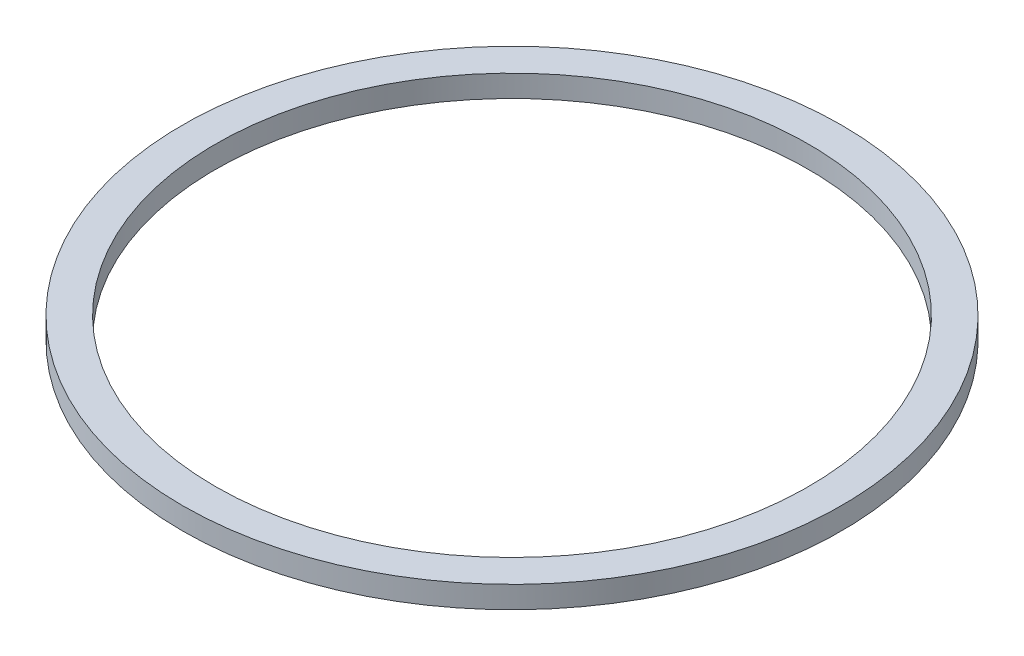
ISO-10303-21;
HEADER;
FILE_DESCRIPTION(('STEP AP214'),'2;1');
FILE_NAME('part.step','',(''),(''),'','','');
FILE_SCHEMA(('AUTOMOTIVE_DESIGN { 1 0 10303 214 1 1 1 1 }'));
ENDSEC;
DATA;
#1=APPLICATION_CONTEXT('core data for automotive mechanical design processes');
#2=APPLICATION_PROTOCOL_DEFINITION('international standard','automotive_design',2000,#1);
#3=PRODUCT_CONTEXT('',#1,'mechanical');
#4=PRODUCT('Part','Part','',(#3));
#5=PRODUCT_RELATED_PRODUCT_CATEGORY('part','',(#4));
#6=PRODUCT_DEFINITION_FORMATION('','',#4);
#7=PRODUCT_DEFINITION_CONTEXT('part definition',#1,'design');
#8=PRODUCT_DEFINITION('design','',#6,#7);
#9=PRODUCT_DEFINITION_SHAPE('','',#8);
#10=(LENGTH_UNIT() NAMED_UNIT(*) SI_UNIT(.MILLI.,.METRE.));
#11=(NAMED_UNIT(*) PLANE_ANGLE_UNIT() SI_UNIT($,.RADIAN.));
#12=(NAMED_UNIT(*) SI_UNIT($,.STERADIAN.) SOLID_ANGLE_UNIT());
#13=UNCERTAINTY_MEASURE_WITH_UNIT(LENGTH_MEASURE(1.E-05),#10,'distance_accuracy_value','');
#14=(GEOMETRIC_REPRESENTATION_CONTEXT(3) GLOBAL_UNCERTAINTY_ASSIGNED_CONTEXT((#13)) GLOBAL_UNIT_ASSIGNED_CONTEXT((#10,
#11,#12)) REPRESENTATION_CONTEXT('',''));
#15=CARTESIAN_POINT('',(0.,0.,0.));
#16=DIRECTION('',(0.,0.,1.));
#17=DIRECTION('',(1.,0.,0.));
#18=AXIS2_PLACEMENT_3D('',#15,#16,#17);
#19=CARTESIAN_POINT('',(0.,1.,0.));
#20=DIRECTION('',(0.,1.,0.));
#21=DIRECTION('',(0.,0.,1.));
#22=AXIS2_PLACEMENT_3D('',#19,#20,#21);
#23=PLANE('',#22);
#24=CARTESIAN_POINT('',(0.,1.,0.));
#25=DIRECTION('',(0.,1.,0.));
#26=DIRECTION('',(0.,0.,1.));
#27=AXIS2_PLACEMENT_3D('',#24,#25,#26);
#28=CIRCLE('',#27,15.);
#29=CARTESIAN_POINT('',(0.,1.,15.));
#30=VERTEX_POINT('',#29);
#31=EDGE_CURVE('E10',#30,#30,#28,.T.);
#32=ORIENTED_EDGE('',*,*,#31,.T.);
#33=EDGE_LOOP('',(#32));
#34=FACE_BOUND('',#33,.T.);
#35=CARTESIAN_POINT('',(0.,1.,0.));
#36=DIRECTION('',(0.,1.,0.));
#37=DIRECTION('',(0.,0.,1.));
#38=AXIS2_PLACEMENT_3D('',#35,#36,#37);
#39=CIRCLE('',#38,13.5);
#40=CARTESIAN_POINT('',(0.,1.,13.5));
#41=VERTEX_POINT('',#40);
#42=EDGE_CURVE('E56',#41,#41,#39,.T.);
#43=ORIENTED_EDGE('',*,*,#42,.F.);
#44=EDGE_LOOP('',(#43));
#45=FACE_BOUND('',#44,.T.);
#46=ADVANCED_FACE('F43',(#34,#45),#23,.T.);
#47=CARTESIAN_POINT('',(0.,0.,0.));
#48=DIRECTION('',(0.,1.,0.));
#49=DIRECTION('',(0.,0.,1.));
#50=AXIS2_PLACEMENT_3D('',#47,#48,#49);
#51=PLANE('',#50);
#52=CARTESIAN_POINT('',(0.,0.,0.));
#53=DIRECTION('',(0.,1.,0.));
#54=DIRECTION('',(0.,0.,1.));
#55=AXIS2_PLACEMENT_3D('',#52,#53,#54);
#56=CIRCLE('',#55,15.);
#57=CARTESIAN_POINT('',(0.,0.,15.));
#58=VERTEX_POINT('',#57);
#59=EDGE_CURVE('E47',#58,#58,#56,.T.);
#60=ORIENTED_EDGE('',*,*,#59,.F.);
#61=EDGE_LOOP('',(#60));
#62=FACE_BOUND('',#61,.T.);
#63=CARTESIAN_POINT('',(0.,0.,0.));
#64=DIRECTION('',(0.,1.,0.));
#65=DIRECTION('',(0.,0.,1.));
#66=AXIS2_PLACEMENT_3D('',#63,#64,#65);
#67=CIRCLE('',#66,13.5);
#68=CARTESIAN_POINT('',(0.,0.,13.5));
#69=VERTEX_POINT('',#68);
#70=EDGE_CURVE('E58',#69,#69,#67,.T.);
#71=ORIENTED_EDGE('',*,*,#70,.T.);
#72=EDGE_LOOP('',(#71));
#73=FACE_BOUND('',#72,.T.);
#74=ADVANCED_FACE('F70',(#62,#73),#51,.F.);
#75=CARTESIAN_POINT('',(0.,1.,0.));
#76=DIRECTION('',(0.,-1.,0.));
#77=DIRECTION('',(0.,0.,-1.));
#78=AXIS2_PLACEMENT_3D('',#75,#76,#77);
#79=CYLINDRICAL_SURFACE('',#78,15.);
#80=ORIENTED_EDGE('',*,*,#31,.F.);
#81=EDGE_LOOP('',(#80));
#82=FACE_BOUND('',#81,.T.);
#83=ORIENTED_EDGE('',*,*,#59,.T.);
#84=EDGE_LOOP('',(#83));
#85=FACE_BOUND('',#84,.T.);
#86=ADVANCED_FACE('F45',(#82,#85),#79,.T.);
#87=CARTESIAN_POINT('',(0.,1.,0.));
#88=DIRECTION('',(0.,-1.,0.));
#89=DIRECTION('',(0.,0.,-1.));
#90=AXIS2_PLACEMENT_3D('',#87,#88,#89);
#91=CYLINDRICAL_SURFACE('',#90,13.5);
#92=ORIENTED_EDGE('',*,*,#42,.T.);
#93=EDGE_LOOP('',(#92));
#94=FACE_BOUND('',#93,.T.);
#95=ORIENTED_EDGE('',*,*,#70,.F.);
#96=EDGE_LOOP('',(#95));
#97=FACE_BOUND('',#96,.T.);
#98=ADVANCED_FACE('F66',(#94,#97),#91,.F.);
#99=CLOSED_SHELL('',(#46,#74,#86,#98));
#100=MANIFOLD_SOLID_BREP('B2',#99);
#101=ADVANCED_BREP_SHAPE_REPRESENTATION('',(#18,#100),#14);
#102=SHAPE_DEFINITION_REPRESENTATION(#9,#101);
ENDSEC;
END-ISO-10303-21;
